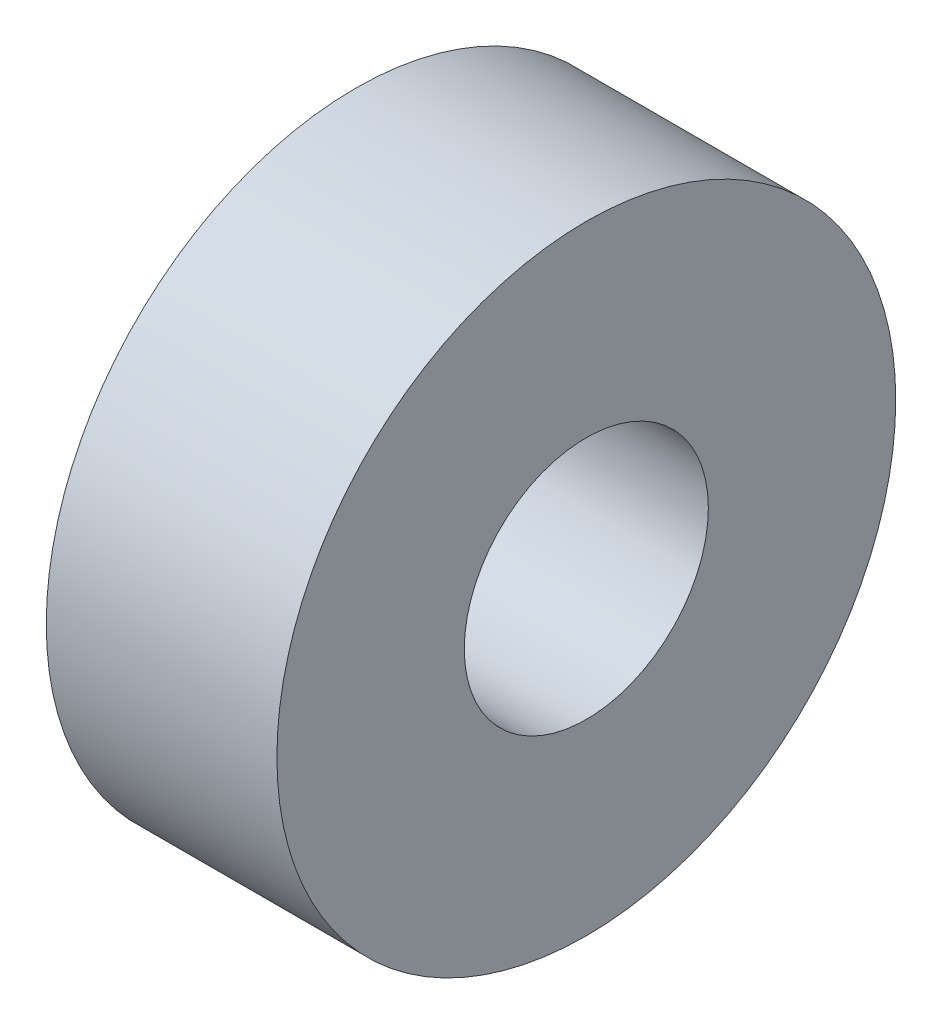
ISO-10303-21;
HEADER;
FILE_DESCRIPTION(('STEP AP214'),'2;1');
FILE_NAME('part.step','',(''),(''),'','','');
FILE_SCHEMA(('AUTOMOTIVE_DESIGN { 1 0 10303 214 1 1 1 1 }'));
ENDSEC;
DATA;
#1=APPLICATION_CONTEXT('core data for automotive mechanical design processes');
#2=APPLICATION_PROTOCOL_DEFINITION('international standard','automotive_design',2000,#1);
#3=PRODUCT_CONTEXT('',#1,'mechanical');
#4=PRODUCT('Part','Part','',(#3));
#5=PRODUCT_RELATED_PRODUCT_CATEGORY('part','',(#4));
#6=PRODUCT_DEFINITION_FORMATION('','',#4);
#7=PRODUCT_DEFINITION_CONTEXT('part definition',#1,'design');
#8=PRODUCT_DEFINITION('design','',#6,#7);
#9=PRODUCT_DEFINITION_SHAPE('','',#8);
#10=(LENGTH_UNIT() NAMED_UNIT(*) SI_UNIT(.MILLI.,.METRE.));
#11=(NAMED_UNIT(*) PLANE_ANGLE_UNIT() SI_UNIT($,.RADIAN.));
#12=(NAMED_UNIT(*) SI_UNIT($,.STERADIAN.) SOLID_ANGLE_UNIT());
#13=UNCERTAINTY_MEASURE_WITH_UNIT(LENGTH_MEASURE(1.E-05),#10,'distance_accuracy_value','');
#14=(GEOMETRIC_REPRESENTATION_CONTEXT(3) GLOBAL_UNCERTAINTY_ASSIGNED_CONTEXT((#13)) GLOBAL_UNIT_ASSIGNED_CONTEXT((#10,
#11,#12)) REPRESENTATION_CONTEXT('',''));
#15=CARTESIAN_POINT('',(0.,0.,0.));
#16=DIRECTION('',(0.,0.,1.));
#17=DIRECTION('',(1.,0.,0.));
#18=AXIS2_PLACEMENT_3D('',#15,#16,#17);
#19=CARTESIAN_POINT('',(-6.,6.85,0.));
#20=DIRECTION('',(1.,0.,0.));
#21=DIRECTION('',(0.,0.,-1.));
#22=AXIS2_PLACEMENT_3D('',#19,#20,#21);
#23=PLANE('',#22);
#24=CARTESIAN_POINT('',(-6.,0.,0.));
#25=DIRECTION('',(-1.,0.,0.));
#26=DIRECTION('',(0.,0.,1.));
#27=AXIS2_PLACEMENT_3D('',#24,#25,#26);
#28=CIRCLE('',#27,6.85);
#29=CARTESIAN_POINT('',(-6.,0.,6.85));
#30=VERTEX_POINT('',#29);
#31=EDGE_CURVE('E72',#30,#30,#28,.T.);
#32=ORIENTED_EDGE('',*,*,#31,.F.);
#33=EDGE_LOOP('',(#32));
#34=FACE_BOUND('',#33,.T.);
#35=CARTESIAN_POINT('',(-6.,0.,0.));
#36=DIRECTION('',(-1.,0.,0.));
#37=DIRECTION('',(0.,0.,1.));
#38=AXIS2_PLACEMENT_3D('',#35,#36,#37);
#39=CIRCLE('',#38,8.05);
#40=CARTESIAN_POINT('',(-6.,0.,8.05));
#41=VERTEX_POINT('',#40);
#42=EDGE_CURVE('E10',#41,#41,#39,.T.);
#43=ORIENTED_EDGE('',*,*,#42,.T.);
#44=EDGE_LOOP('',(#43));
#45=FACE_BOUND('',#44,.T.);
#46=ADVANCED_FACE('F37',(#34,#45),#23,.F.);
#47=CARTESIAN_POINT('',(-5.71217261860236,0.,0.));
#48=DIRECTION('',(-1.,0.,0.));
#49=DIRECTION('',(0.,0.,1.));
#50=AXIS2_PLACEMENT_3D('',#47,#48,#49);
#51=CYLINDRICAL_SURFACE('',#50,8.05);
#52=ORIENTED_EDGE('',*,*,#42,.F.);
#53=EDGE_LOOP('',(#52));
#54=FACE_BOUND('',#53,.T.);
#55=CARTESIAN_POINT('',(0.,0.,0.));
#56=DIRECTION('',(-1.,0.,0.));
#57=DIRECTION('',(0.,0.,1.));
#58=AXIS2_PLACEMENT_3D('',#55,#56,#57);
#59=CIRCLE('',#58,8.05);
#60=CARTESIAN_POINT('',(0.,0.,8.05));
#61=VERTEX_POINT('',#60);
#62=EDGE_CURVE('E44',#61,#61,#59,.T.);
#63=ORIENTED_EDGE('',*,*,#62,.T.);
#64=EDGE_LOOP('',(#63));
#65=FACE_BOUND('',#64,.T.);
#66=ADVANCED_FACE('F80',(#54,#65),#51,.T.);
#67=CARTESIAN_POINT('',(0.,8.05,0.));
#68=DIRECTION('',(-1.,0.,0.));
#69=DIRECTION('',(0.,0.,1.));
#70=AXIS2_PLACEMENT_3D('',#67,#68,#69);
#71=PLANE('',#70);
#72=ORIENTED_EDGE('',*,*,#62,.F.);
#73=EDGE_LOOP('',(#72));
#74=FACE_BOUND('',#73,.T.);
#75=CARTESIAN_POINT('',(0.,0.,0.));
#76=DIRECTION('',(-1.,0.,0.));
#77=DIRECTION('',(0.,0.,1.));
#78=AXIS2_PLACEMENT_3D('',#75,#76,#77);
#79=CIRCLE('',#78,3.175);
#80=CARTESIAN_POINT('',(0.,0.,3.175));
#81=VERTEX_POINT('',#80);
#82=EDGE_CURVE('E49',#81,#81,#79,.T.);
#83=ORIENTED_EDGE('',*,*,#82,.T.);
#84=EDGE_LOOP('',(#83));
#85=FACE_BOUND('',#84,.T.);
#86=ADVANCED_FACE('F84',(#74,#85),#71,.F.);
#87=CARTESIAN_POINT('',(-5.71217261860236,0.,0.));
#88=DIRECTION('',(-1.,0.,0.));
#89=DIRECTION('',(0.,0.,1.));
#90=AXIS2_PLACEMENT_3D('',#87,#88,#89);
#91=CYLINDRICAL_SURFACE('',#90,3.175);
#92=ORIENTED_EDGE('',*,*,#82,.F.);
#93=EDGE_LOOP('',(#92));
#94=FACE_BOUND('',#93,.T.);
#95=CARTESIAN_POINT('',(-5.,0.,0.));
#96=DIRECTION('',(-1.,0.,0.));
#97=DIRECTION('',(0.,0.,1.));
#98=AXIS2_PLACEMENT_3D('',#95,#96,#97);
#99=CIRCLE('',#98,3.175);
#100=CARTESIAN_POINT('',(-5.,0.,3.175));
#101=VERTEX_POINT('',#100);
#102=EDGE_CURVE('E54',#101,#101,#99,.T.);
#103=ORIENTED_EDGE('',*,*,#102,.T.);
#104=EDGE_LOOP('',(#103));
#105=FACE_BOUND('',#104,.T.);
#106=ADVANCED_FACE('F89',(#94,#105),#91,.F.);
#107=CARTESIAN_POINT('',(-5.,3.175,0.));
#108=DIRECTION('',(1.,0.,0.));
#109=DIRECTION('',(0.,0.,-1.));
#110=AXIS2_PLACEMENT_3D('',#107,#108,#109);
#111=PLANE('',#110);
#112=ORIENTED_EDGE('',*,*,#102,.F.);
#113=EDGE_LOOP('',(#112));
#114=FACE_BOUND('',#113,.T.);
#115=CARTESIAN_POINT('',(-5.,0.,0.));
#116=DIRECTION('',(-1.,0.,0.));
#117=DIRECTION('',(0.,0.,1.));
#118=AXIS2_PLACEMENT_3D('',#115,#116,#117);
#119=CIRCLE('',#118,4.535);
#120=CARTESIAN_POINT('',(-5.,0.,4.535));
#121=VERTEX_POINT('',#120);
#122=EDGE_CURVE('E60',#121,#121,#119,.T.);
#123=ORIENTED_EDGE('',*,*,#122,.T.);
#124=EDGE_LOOP('',(#123));
#125=FACE_BOUND('',#124,.T.);
#126=ADVANCED_FACE('F95',(#114,#125),#111,.F.);
#127=CARTESIAN_POINT('',(-5.71217261860236,0.,0.));
#128=DIRECTION('',(-1.,0.,0.));
#129=DIRECTION('',(0.,0.,1.));
#130=AXIS2_PLACEMENT_3D('',#127,#128,#129);
#131=CYLINDRICAL_SURFACE('',#130,4.535);
#132=ORIENTED_EDGE('',*,*,#122,.F.);
#133=EDGE_LOOP('',(#132));
#134=FACE_BOUND('',#133,.T.);
#135=CARTESIAN_POINT('',(-1.55,0.,0.));
#136=DIRECTION('',(-1.,0.,0.));
#137=DIRECTION('',(0.,0.,1.));
#138=AXIS2_PLACEMENT_3D('',#135,#136,#137);
#139=CIRCLE('',#138,4.535);
#140=CARTESIAN_POINT('',(-1.55,0.,4.535));
#141=VERTEX_POINT('',#140);
#142=EDGE_CURVE('E64',#141,#141,#139,.T.);
#143=ORIENTED_EDGE('',*,*,#142,.T.);
#144=EDGE_LOOP('',(#143));
#145=FACE_BOUND('',#144,.T.);
#146=ADVANCED_FACE('F99',(#134,#145),#131,.T.);
#147=CARTESIAN_POINT('',(-1.55,4.535,0.));
#148=DIRECTION('',(1.,0.,0.));
#149=DIRECTION('',(0.,0.,-1.));
#150=AXIS2_PLACEMENT_3D('',#147,#148,#149);
#151=PLANE('',#150);
#152=ORIENTED_EDGE('',*,*,#142,.F.);
#153=EDGE_LOOP('',(#152));
#154=FACE_BOUND('',#153,.T.);
#155=CARTESIAN_POINT('',(-1.55,0.,0.));
#156=DIRECTION('',(-1.,0.,0.));
#157=DIRECTION('',(0.,0.,1.));
#158=AXIS2_PLACEMENT_3D('',#155,#156,#157);
#159=CIRCLE('',#158,6.85);
#160=CARTESIAN_POINT('',(-1.55,0.,6.85));
#161=VERTEX_POINT('',#160);
#162=EDGE_CURVE('E68',#161,#161,#159,.T.);
#163=ORIENTED_EDGE('',*,*,#162,.T.);
#164=EDGE_LOOP('',(#163));
#165=FACE_BOUND('',#164,.T.);
#166=ADVANCED_FACE('F103',(#154,#165),#151,.F.);
#167=CARTESIAN_POINT('',(-5.71217261860236,0.,0.));
#168=DIRECTION('',(-1.,0.,0.));
#169=DIRECTION('',(0.,0.,1.));
#170=AXIS2_PLACEMENT_3D('',#167,#168,#169);
#171=CYLINDRICAL_SURFACE('',#170,6.85);
#172=ORIENTED_EDGE('',*,*,#162,.F.);
#173=EDGE_LOOP('',(#172));
#174=FACE_BOUND('',#173,.T.);
#175=ORIENTED_EDGE('',*,*,#31,.T.);
#176=EDGE_LOOP('',(#175));
#177=FACE_BOUND('',#176,.T.);
#178=ADVANCED_FACE('F77',(#174,#177),#171,.F.);
#179=CLOSED_SHELL('',(#46,#66,#86,#106,#126,#146,#166,#178));
#180=MANIFOLD_SOLID_BREP('B2',#179);
#181=ADVANCED_BREP_SHAPE_REPRESENTATION('',(#18,#180),#14);
#182=SHAPE_DEFINITION_REPRESENTATION(#9,#181);
ENDSEC;
END-ISO-10303-21;
